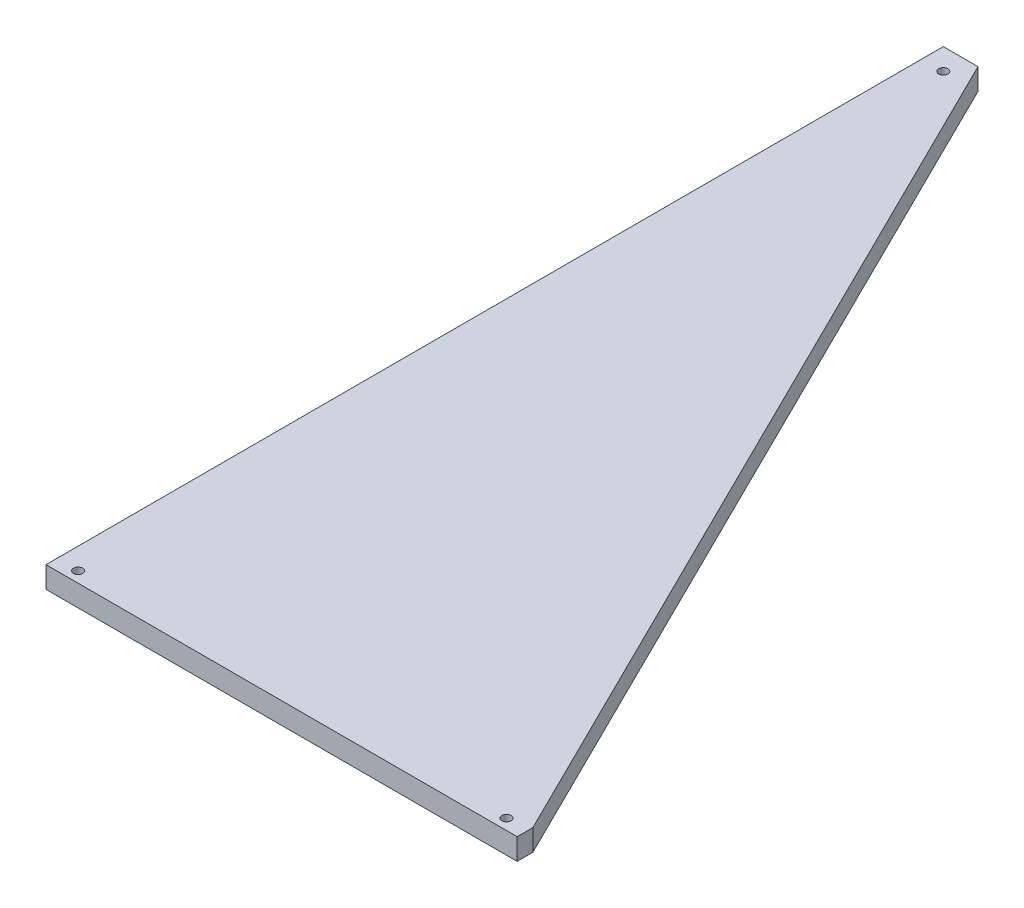
ISO-10303-21;
HEADER;
FILE_DESCRIPTION(('STEP AP214'),'2;1');
FILE_NAME('part.step','',(''),(''),'','','');
FILE_SCHEMA(('AUTOMOTIVE_DESIGN { 1 0 10303 214 1 1 1 1 }'));
ENDSEC;
DATA;
#1=APPLICATION_CONTEXT('core data for automotive mechanical design processes');
#2=APPLICATION_PROTOCOL_DEFINITION('international standard','automotive_design',2000,#1);
#3=PRODUCT_CONTEXT('',#1,'mechanical');
#4=PRODUCT('Part','Part','',(#3));
#5=PRODUCT_RELATED_PRODUCT_CATEGORY('part','',(#4));
#6=PRODUCT_DEFINITION_FORMATION('','',#4);
#7=PRODUCT_DEFINITION_CONTEXT('part definition',#1,'design');
#8=PRODUCT_DEFINITION('design','',#6,#7);
#9=PRODUCT_DEFINITION_SHAPE('','',#8);
#10=(LENGTH_UNIT() NAMED_UNIT(*) SI_UNIT(.MILLI.,.METRE.));
#11=(NAMED_UNIT(*) PLANE_ANGLE_UNIT() SI_UNIT($,.RADIAN.));
#12=(NAMED_UNIT(*) SI_UNIT($,.STERADIAN.) SOLID_ANGLE_UNIT());
#13=UNCERTAINTY_MEASURE_WITH_UNIT(LENGTH_MEASURE(1.E-05),#10,'distance_accuracy_value','');
#14=(GEOMETRIC_REPRESENTATION_CONTEXT(3) GLOBAL_UNCERTAINTY_ASSIGNED_CONTEXT((#13)) GLOBAL_UNIT_ASSIGNED_CONTEXT((#10,
#11,#12)) REPRESENTATION_CONTEXT('',''));
#15=CARTESIAN_POINT('',(0.,0.,0.));
#16=DIRECTION('',(0.,0.,1.));
#17=DIRECTION('',(1.,0.,0.));
#18=AXIS2_PLACEMENT_3D('',#15,#16,#17);
#19=CARTESIAN_POINT('',(0.,10.,0.));
#20=DIRECTION('',(0.,1.,0.));
#21=DIRECTION('',(0.,0.,1.));
#22=AXIS2_PLACEMENT_3D('',#19,#20,#21);
#23=PLANE('',#22);
#24=CARTESIAN_POINT('',(0.,10.,0.));
#25=DIRECTION('',(0.,1.,0.));
#26=DIRECTION('',(0.,0.,1.));
#27=AXIS2_PLACEMENT_3D('',#24,#25,#26);
#28=CIRCLE('',#27,2.15);
#29=CARTESIAN_POINT('',(0.,10.,2.15));
#30=VERTEX_POINT('',#29);
#31=EDGE_CURVE('E167',#30,#30,#28,.T.);
#32=ORIENTED_EDGE('',*,*,#31,.F.);
#33=EDGE_LOOP('',(#32));
#34=FACE_BOUND('',#33,.T.);
#35=DIRECTION('',(-1.,0.,0.));
#36=VECTOR('',#35,1.);
#37=CARTESIAN_POINT('',(6.20775648436328,10.,-413.994584245878));
#38=LINE('',#37,#36);
#39=CARTESIAN_POINT('',(6.20775648436328,10.,-413.994584245878));
#40=VERTEX_POINT('',#39);
#41=CARTESIAN_POINT('',(-10.,10.,-413.994584245878));
#42=VERTEX_POINT('',#41);
#43=EDGE_CURVE('E117',#40,#42,#38,.T.);
#44=ORIENTED_EDGE('',*,*,#43,.T.);
#45=DIRECTION('',(0.,0.,1.));
#46=VECTOR('',#45,1.);
#47=CARTESIAN_POINT('',(-10.,10.,-413.994584245878));
#48=LINE('',#47,#46);
#49=CARTESIAN_POINT('',(-9.99999999999995,10.,5.));
#50=VERTEX_POINT('',#49);
#51=EDGE_CURVE('E84',#42,#50,#48,.T.);
#52=ORIENTED_EDGE('',*,*,#51,.T.);
#53=DIRECTION('',(1.,0.,0.));
#54=VECTOR('',#53,1.);
#55=CARTESIAN_POINT('',(-9.99999999999995,10.,5.));
#56=LINE('',#55,#54);
#57=CARTESIAN_POINT('',(210.,10.,5.));
#58=VERTEX_POINT('',#57);
#59=EDGE_CURVE('E88',#50,#58,#56,.T.);
#60=ORIENTED_EDGE('',*,*,#59,.T.);
#61=DIRECTION('',(0.,0.,-1.));
#62=VECTOR('',#61,1.);
#63=CARTESIAN_POINT('',(210.,10.,5.));
#64=LINE('',#63,#62);
#65=CARTESIAN_POINT('',(210.,10.,-2.33977078770605));
#66=VERTEX_POINT('',#65);
#67=EDGE_CURVE('E92',#58,#66,#64,.T.);
#68=ORIENTED_EDGE('',*,*,#67,.T.);
#69=DIRECTION('',(-0.44366556489718,0.,-0.896192427174246));
#70=VECTOR('',#69,1.);
#71=CARTESIAN_POINT('',(210.,10.,-2.33977078770605));
#72=LINE('',#71,#70);
#73=EDGE_CURVE('E50',#66,#40,#72,.T.);
#74=ORIENTED_EDGE('',*,*,#73,.T.);
#75=EDGE_LOOP('',(#44,#52,#60,#68,#74));
#76=FACE_BOUND('',#75,.T.);
#77=CARTESIAN_POINT('',(0.,10.,-403.994584245878));
#78=DIRECTION('',(0.,1.,0.));
#79=DIRECTION('',(0.,0.,1.));
#80=AXIS2_PLACEMENT_3D('',#77,#78,#79);
#81=CIRCLE('',#80,2.15);
#82=CARTESIAN_POINT('',(0.,10.,-401.844584245878));
#83=VERTEX_POINT('',#82);
#84=EDGE_CURVE('E112',#83,#83,#81,.T.);
#85=ORIENTED_EDGE('',*,*,#84,.F.);
#86=EDGE_LOOP('',(#85));
#87=FACE_BOUND('',#86,.T.);
#88=CARTESIAN_POINT('',(200.,10.,0.));
#89=DIRECTION('',(0.,1.,0.));
#90=DIRECTION('',(0.,0.,1.));
#91=AXIS2_PLACEMENT_3D('',#88,#89,#90);
#92=CIRCLE('',#91,2.15000000000002);
#93=CARTESIAN_POINT('',(200.,10.,2.15000000000002));
#94=VERTEX_POINT('',#93);
#95=EDGE_CURVE('E158',#94,#94,#92,.T.);
#96=ORIENTED_EDGE('',*,*,#95,.F.);
#97=EDGE_LOOP('',(#96));
#98=FACE_BOUND('',#97,.T.);
#99=ADVANCED_FACE('F33',(#34,#76,#87,#98),#23,.T.);
#100=CARTESIAN_POINT('',(0.,0.,0.));
#101=DIRECTION('',(0.,1.,0.));
#102=DIRECTION('',(0.,0.,1.));
#103=AXIS2_PLACEMENT_3D('',#100,#101,#102);
#104=PLANE('',#103);
#105=DIRECTION('',(-1.,0.,0.));
#106=VECTOR('',#105,1.);
#107=CARTESIAN_POINT('',(6.20775648436328,0.,-413.994584245878));
#108=LINE('',#107,#106);
#109=CARTESIAN_POINT('',(6.20775648436328,0.,-413.994584245878));
#110=VERTEX_POINT('',#109);
#111=CARTESIAN_POINT('',(-10.,0.,-413.994584245878));
#112=VERTEX_POINT('',#111);
#113=EDGE_CURVE('E108',#110,#112,#108,.T.);
#114=ORIENTED_EDGE('',*,*,#113,.F.);
#115=DIRECTION('',(-0.44366556489718,0.,-0.896192427174246));
#116=VECTOR('',#115,1.);
#117=CARTESIAN_POINT('',(210.,0.,-2.33977078770605));
#118=LINE('',#117,#116);
#119=CARTESIAN_POINT('',(210.,0.,-2.33977078770605));
#120=VERTEX_POINT('',#119);
#121=EDGE_CURVE('E76',#120,#110,#118,.T.);
#122=ORIENTED_EDGE('',*,*,#121,.F.);
#123=DIRECTION('',(0.,0.,-1.));
#124=VECTOR('',#123,1.);
#125=CARTESIAN_POINT('',(210.,0.,5.));
#126=LINE('',#125,#124);
#127=CARTESIAN_POINT('',(210.,0.,5.));
#128=VERTEX_POINT('',#127);
#129=EDGE_CURVE('E70',#128,#120,#126,.T.);
#130=ORIENTED_EDGE('',*,*,#129,.F.);
#131=DIRECTION('',(1.,0.,0.));
#132=VECTOR('',#131,1.);
#133=CARTESIAN_POINT('',(-9.99999999999995,0.,5.));
#134=LINE('',#133,#132);
#135=CARTESIAN_POINT('',(-9.99999999999995,0.,5.));
#136=VERTEX_POINT('',#135);
#137=EDGE_CURVE('E99',#136,#128,#134,.T.);
#138=ORIENTED_EDGE('',*,*,#137,.F.);
#139=DIRECTION('',(0.,0.,1.));
#140=VECTOR('',#139,1.);
#141=CARTESIAN_POINT('',(-10.,0.,-413.994584245878));
#142=LINE('',#141,#140);
#143=EDGE_CURVE('E111',#112,#136,#142,.T.);
#144=ORIENTED_EDGE('',*,*,#143,.F.);
#145=EDGE_LOOP('',(#114,#122,#130,#138,#144));
#146=FACE_BOUND('',#145,.T.);
#147=CARTESIAN_POINT('',(0.,0.,-403.994584245878));
#148=DIRECTION('',(0.,1.,0.));
#149=DIRECTION('',(0.,0.,1.));
#150=AXIS2_PLACEMENT_3D('',#147,#148,#149);
#151=CIRCLE('',#150,2.15);
#152=CARTESIAN_POINT('',(0.,0.,-401.844584245878));
#153=VERTEX_POINT('',#152);
#154=EDGE_CURVE('E170',#153,#153,#151,.T.);
#155=ORIENTED_EDGE('',*,*,#154,.T.);
#156=EDGE_LOOP('',(#155));
#157=FACE_BOUND('',#156,.T.);
#158=CARTESIAN_POINT('',(0.,0.,0.));
#159=DIRECTION('',(0.,1.,0.));
#160=DIRECTION('',(0.,0.,1.));
#161=AXIS2_PLACEMENT_3D('',#158,#159,#160);
#162=CIRCLE('',#161,2.15);
#163=CARTESIAN_POINT('',(0.,0.,2.15));
#164=VERTEX_POINT('',#163);
#165=EDGE_CURVE('E164',#164,#164,#162,.T.);
#166=ORIENTED_EDGE('',*,*,#165,.T.);
#167=EDGE_LOOP('',(#166));
#168=FACE_BOUND('',#167,.T.);
#169=CARTESIAN_POINT('',(200.,0.,0.));
#170=DIRECTION('',(0.,1.,0.));
#171=DIRECTION('',(0.,0.,1.));
#172=AXIS2_PLACEMENT_3D('',#169,#170,#171);
#173=CIRCLE('',#172,2.15000000000002);
#174=CARTESIAN_POINT('',(200.,0.,2.15000000000002));
#175=VERTEX_POINT('',#174);
#176=EDGE_CURVE('E161',#175,#175,#173,.T.);
#177=ORIENTED_EDGE('',*,*,#176,.T.);
#178=EDGE_LOOP('',(#177));
#179=FACE_BOUND('',#178,.T.);
#180=ADVANCED_FACE('F121',(#146,#157,#168,#179),#104,.F.);
#181=CARTESIAN_POINT('',(6.20775648436328,10.,-413.994584245878));
#182=DIRECTION('',(0.,0.,1.));
#183=DIRECTION('',(1.,0.,0.));
#184=AXIS2_PLACEMENT_3D('',#181,#182,#183);
#185=PLANE('',#184);
#186=ORIENTED_EDGE('',*,*,#113,.T.);
#187=DIRECTION('',(0.,-1.,0.));
#188=VECTOR('',#187,1.);
#189=CARTESIAN_POINT('',(-10.,10.,-413.994584245878));
#190=LINE('',#189,#188);
#191=EDGE_CURVE('E11',#42,#112,#190,.T.);
#192=ORIENTED_EDGE('',*,*,#191,.F.);
#193=ORIENTED_EDGE('',*,*,#43,.F.);
#194=DIRECTION('',(0.,-1.,0.));
#195=VECTOR('',#194,1.);
#196=CARTESIAN_POINT('',(6.20775648436328,10.,-413.994584245878));
#197=LINE('',#196,#195);
#198=EDGE_CURVE('E104',#40,#110,#197,.T.);
#199=ORIENTED_EDGE('',*,*,#198,.T.);
#200=EDGE_LOOP('',(#186,#192,#193,#199));
#201=FACE_BOUND('',#200,.T.);
#202=ADVANCED_FACE('F35',(#201),#185,.F.);
#203=CARTESIAN_POINT('',(-10.,10.,-413.994584245878));
#204=DIRECTION('',(1.,0.,0.));
#205=DIRECTION('',(0.,0.,-1.));
#206=AXIS2_PLACEMENT_3D('',#203,#204,#205);
#207=PLANE('',#206);
#208=ORIENTED_EDGE('',*,*,#143,.T.);
#209=DIRECTION('',(0.,-1.,0.));
#210=VECTOR('',#209,1.);
#211=CARTESIAN_POINT('',(-9.99999999999995,10.,5.));
#212=LINE('',#211,#210);
#213=EDGE_CURVE('E42',#50,#136,#212,.T.);
#214=ORIENTED_EDGE('',*,*,#213,.F.);
#215=ORIENTED_EDGE('',*,*,#51,.F.);
#216=ORIENTED_EDGE('',*,*,#191,.T.);
#217=EDGE_LOOP('',(#208,#214,#215,#216));
#218=FACE_BOUND('',#217,.T.);
#219=ADVANCED_FACE('F211',(#218),#207,.F.);
#220=CARTESIAN_POINT('',(-9.99999999999995,10.,5.));
#221=DIRECTION('',(0.,0.,-1.));
#222=DIRECTION('',(-1.,0.,0.));
#223=AXIS2_PLACEMENT_3D('',#220,#221,#222);
#224=PLANE('',#223);
#225=ORIENTED_EDGE('',*,*,#137,.T.);
#226=DIRECTION('',(0.,-1.,0.));
#227=VECTOR('',#226,1.);
#228=CARTESIAN_POINT('',(210.,10.,5.));
#229=LINE('',#228,#227);
#230=EDGE_CURVE('E96',#58,#128,#229,.T.);
#231=ORIENTED_EDGE('',*,*,#230,.F.);
#232=ORIENTED_EDGE('',*,*,#59,.F.);
#233=ORIENTED_EDGE('',*,*,#213,.T.);
#234=EDGE_LOOP('',(#225,#231,#232,#233));
#235=FACE_BOUND('',#234,.T.);
#236=ADVANCED_FACE('F97',(#235),#224,.F.);
#237=CARTESIAN_POINT('',(210.,10.,5.));
#238=DIRECTION('',(-1.,0.,0.));
#239=DIRECTION('',(0.,0.,1.));
#240=AXIS2_PLACEMENT_3D('',#237,#238,#239);
#241=PLANE('',#240);
#242=ORIENTED_EDGE('',*,*,#129,.T.);
#243=DIRECTION('',(0.,-1.,0.));
#244=VECTOR('',#243,1.);
#245=CARTESIAN_POINT('',(210.,10.,-2.33977078770605));
#246=LINE('',#245,#244);
#247=EDGE_CURVE('E100',#66,#120,#246,.T.);
#248=ORIENTED_EDGE('',*,*,#247,.F.);
#249=ORIENTED_EDGE('',*,*,#67,.F.);
#250=ORIENTED_EDGE('',*,*,#230,.T.);
#251=EDGE_LOOP('',(#242,#248,#249,#250));
#252=FACE_BOUND('',#251,.T.);
#253=ADVANCED_FACE('F102',(#252),#241,.F.);
#254=CARTESIAN_POINT('',(210.,10.,-2.33977078770605));
#255=DIRECTION('',(-0.896192427174246,0.,0.44366556489718));
#256=DIRECTION('',(0.44366556489718,0.,0.896192427174246));
#257=AXIS2_PLACEMENT_3D('',#254,#255,#256);
#258=PLANE('',#257);
#259=ORIENTED_EDGE('',*,*,#121,.T.);
#260=ORIENTED_EDGE('',*,*,#198,.F.);
#261=ORIENTED_EDGE('',*,*,#73,.F.);
#262=ORIENTED_EDGE('',*,*,#247,.T.);
#263=EDGE_LOOP('',(#259,#260,#261,#262));
#264=FACE_BOUND('',#263,.T.);
#265=ADVANCED_FACE('F126',(#264),#258,.F.);
#266=CARTESIAN_POINT('',(0.,10.,-403.994584245878));
#267=DIRECTION('',(0.,-1.,0.));
#268=DIRECTION('',(0.,0.,-1.));
#269=AXIS2_PLACEMENT_3D('',#266,#267,#268);
#270=CYLINDRICAL_SURFACE('',#269,2.15);
#271=ORIENTED_EDGE('',*,*,#84,.T.);
#272=EDGE_LOOP('',(#271));
#273=FACE_BOUND('',#272,.T.);
#274=ORIENTED_EDGE('',*,*,#154,.F.);
#275=EDGE_LOOP('',(#274));
#276=FACE_BOUND('',#275,.T.);
#277=ADVANCED_FACE('F128',(#273,#276),#270,.F.);
#278=CARTESIAN_POINT('',(0.,10.,0.));
#279=DIRECTION('',(0.,-1.,0.));
#280=DIRECTION('',(0.,0.,-1.));
#281=AXIS2_PLACEMENT_3D('',#278,#279,#280);
#282=CYLINDRICAL_SURFACE('',#281,2.15);
#283=ORIENTED_EDGE('',*,*,#31,.T.);
#284=EDGE_LOOP('',(#283));
#285=FACE_BOUND('',#284,.T.);
#286=ORIENTED_EDGE('',*,*,#165,.F.);
#287=EDGE_LOOP('',(#286));
#288=FACE_BOUND('',#287,.T.);
#289=ADVANCED_FACE('F134',(#285,#288),#282,.F.);
#290=CARTESIAN_POINT('',(200.,10.,0.));
#291=DIRECTION('',(0.,-1.,0.));
#292=DIRECTION('',(0.,0.,-1.));
#293=AXIS2_PLACEMENT_3D('',#290,#291,#292);
#294=CYLINDRICAL_SURFACE('',#293,2.15000000000002);
#295=ORIENTED_EDGE('',*,*,#95,.T.);
#296=EDGE_LOOP('',(#295));
#297=FACE_BOUND('',#296,.T.);
#298=ORIENTED_EDGE('',*,*,#176,.F.);
#299=EDGE_LOOP('',(#298));
#300=FACE_BOUND('',#299,.T.);
#301=ADVANCED_FACE('F149',(#297,#300),#294,.F.);
#302=CLOSED_SHELL('',(#99,#180,#202,#219,#236,#253,#265,#277,#289,#301));
#303=MANIFOLD_SOLID_BREP('B2',#302);
#304=ADVANCED_BREP_SHAPE_REPRESENTATION('',(#18,#303),#14);
#305=SHAPE_DEFINITION_REPRESENTATION(#9,#304);
ENDSEC;
END-ISO-10303-21;
